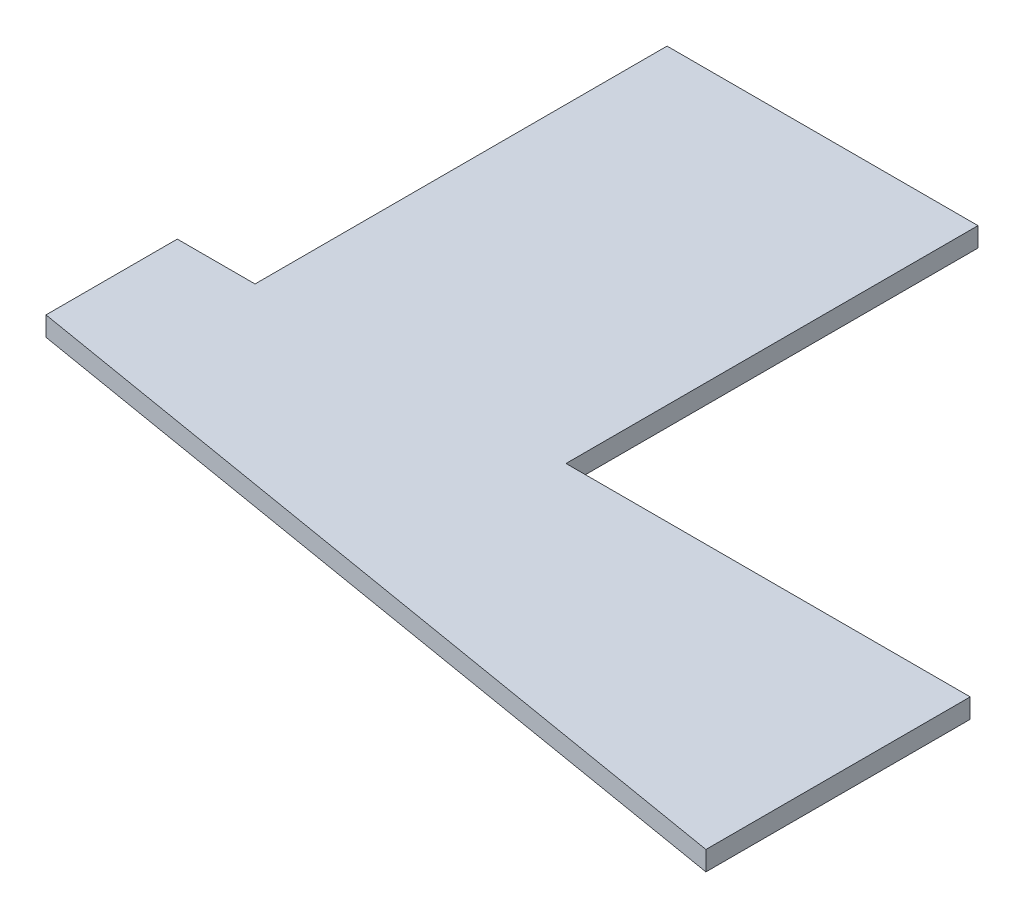
ISO-10303-21;
HEADER;
FILE_DESCRIPTION(('STEP AP214'),'2;1');
FILE_NAME('part.step','',(''),(''),'','','');
FILE_SCHEMA(('AUTOMOTIVE_DESIGN { 1 0 10303 214 1 1 1 1 }'));
ENDSEC;
DATA;
#1=APPLICATION_CONTEXT('core data for automotive mechanical design processes');
#2=APPLICATION_PROTOCOL_DEFINITION('international standard','automotive_design',2000,#1);
#3=PRODUCT_CONTEXT('',#1,'mechanical');
#4=PRODUCT('Part','Part','',(#3));
#5=PRODUCT_RELATED_PRODUCT_CATEGORY('part','',(#4));
#6=PRODUCT_DEFINITION_FORMATION('','',#4);
#7=PRODUCT_DEFINITION_CONTEXT('part definition',#1,'design');
#8=PRODUCT_DEFINITION('design','',#6,#7);
#9=PRODUCT_DEFINITION_SHAPE('','',#8);
#10=(LENGTH_UNIT() NAMED_UNIT(*) SI_UNIT(.MILLI.,.METRE.));
#11=(NAMED_UNIT(*) PLANE_ANGLE_UNIT() SI_UNIT($,.RADIAN.));
#12=(NAMED_UNIT(*) SI_UNIT($,.STERADIAN.) SOLID_ANGLE_UNIT());
#13=UNCERTAINTY_MEASURE_WITH_UNIT(LENGTH_MEASURE(1.E-05),#10,'distance_accuracy_value','');
#14=(GEOMETRIC_REPRESENTATION_CONTEXT(3) GLOBAL_UNCERTAINTY_ASSIGNED_CONTEXT((#13)) GLOBAL_UNIT_ASSIGNED_CONTEXT((#10,
#11,#12)) REPRESENTATION_CONTEXT('',''));
#15=CARTESIAN_POINT('',(0.,0.,0.));
#16=DIRECTION('',(0.,0.,1.));
#17=DIRECTION('',(1.,0.,0.));
#18=AXIS2_PLACEMENT_3D('',#15,#16,#17);
#19=CARTESIAN_POINT('',(-12.7,3.175,0.));
#20=DIRECTION('',(0.,0.,1.));
#21=DIRECTION('',(1.,0.,0.));
#22=AXIS2_PLACEMENT_3D('',#19,#20,#21);
#23=PLANE('',#22);
#24=DIRECTION('',(-1.,0.,0.));
#25=VECTOR('',#24,1.);
#26=CARTESIAN_POINT('',(-12.7,0.,0.));
#27=LINE('',#26,#25);
#28=CARTESIAN_POINT('',(0.,0.,0.));
#29=VERTEX_POINT('',#28);
#30=CARTESIAN_POINT('',(-12.7,0.,0.));
#31=VERTEX_POINT('',#30);
#32=EDGE_CURVE('E133',#29,#31,#27,.T.);
#33=ORIENTED_EDGE('',*,*,#32,.T.);
#34=DIRECTION('',(0.,-1.,0.));
#35=VECTOR('',#34,1.);
#36=CARTESIAN_POINT('',(-12.7,3.175,0.));
#37=LINE('',#36,#35);
#38=CARTESIAN_POINT('',(-12.7,3.175,0.));
#39=VERTEX_POINT('',#38);
#40=EDGE_CURVE('E11',#39,#31,#37,.T.);
#41=ORIENTED_EDGE('',*,*,#40,.F.);
#42=DIRECTION('',(-1.,0.,0.));
#43=VECTOR('',#42,1.);
#44=CARTESIAN_POINT('',(-12.7,3.175,0.));
#45=LINE('',#44,#43);
#46=CARTESIAN_POINT('',(0.,3.175,0.));
#47=VERTEX_POINT('',#46);
#48=EDGE_CURVE('E147',#47,#39,#45,.T.);
#49=ORIENTED_EDGE('',*,*,#48,.F.);
#50=DIRECTION('',(0.,-1.,0.));
#51=VECTOR('',#50,1.);
#52=CARTESIAN_POINT('',(0.,3.175,0.));
#53=LINE('',#52,#51);
#54=EDGE_CURVE('E129',#47,#29,#53,.T.);
#55=ORIENTED_EDGE('',*,*,#54,.T.);
#56=EDGE_LOOP('',(#33,#41,#49,#55));
#57=FACE_BOUND('',#56,.T.);
#58=ADVANCED_FACE('F37',(#57),#23,.F.);
#59=CARTESIAN_POINT('',(-12.7,3.175,21.449244854584));
#60=DIRECTION('',(1.,0.,0.));
#61=DIRECTION('',(0.,0.,-1.));
#62=AXIS2_PLACEMENT_3D('',#59,#60,#61);
#63=PLANE('',#62);
#64=DIRECTION('',(0.,0.,1.));
#65=VECTOR('',#64,1.);
#66=CARTESIAN_POINT('',(-12.7,0.,21.449244854584));
#67=LINE('',#66,#65);
#68=CARTESIAN_POINT('',(-12.7,0.,21.449244854584));
#69=VERTEX_POINT('',#68);
#70=EDGE_CURVE('E136',#31,#69,#67,.T.);
#71=ORIENTED_EDGE('',*,*,#70,.T.);
#72=DIRECTION('',(0.,-1.,0.));
#73=VECTOR('',#72,1.);
#74=CARTESIAN_POINT('',(-12.7,3.175,21.449244854584));
#75=LINE('',#74,#73);
#76=CARTESIAN_POINT('',(-12.7,3.175,21.449244854584));
#77=VERTEX_POINT('',#76);
#78=EDGE_CURVE('E45',#77,#69,#75,.T.);
#79=ORIENTED_EDGE('',*,*,#78,.F.);
#80=DIRECTION('',(0.,0.,1.));
#81=VECTOR('',#80,1.);
#82=CARTESIAN_POINT('',(-12.7,3.175,21.449244854584));
#83=LINE('',#82,#81);
#84=EDGE_CURVE('E96',#39,#77,#83,.T.);
#85=ORIENTED_EDGE('',*,*,#84,.F.);
#86=ORIENTED_EDGE('',*,*,#40,.T.);
#87=EDGE_LOOP('',(#71,#79,#85,#86));
#88=FACE_BOUND('',#87,.T.);
#89=ADVANCED_FACE('F182',(#88),#63,.F.);
#90=CARTESIAN_POINT('',(116.84,3.175,43.18));
#91=DIRECTION('',(0.165441536449811,0.,-0.986219599286653));
#92=DIRECTION('',(-0.986219599286653,0.,-0.165441536449811));
#93=AXIS2_PLACEMENT_3D('',#90,#91,#92);
#94=PLANE('',#93);
#95=DIRECTION('',(0.986219599286653,0.,0.165441536449811));
#96=VECTOR('',#95,1.);
#97=CARTESIAN_POINT('',(116.84,0.,43.18));
#98=LINE('',#97,#96);
#99=CARTESIAN_POINT('',(116.84,0.,43.18));
#100=VERTEX_POINT('',#99);
#101=EDGE_CURVE('E138',#69,#100,#98,.T.);
#102=ORIENTED_EDGE('',*,*,#101,.T.);
#103=DIRECTION('',(0.,-1.,0.));
#104=VECTOR('',#103,1.);
#105=CARTESIAN_POINT('',(116.84,3.175,43.18));
#106=LINE('',#105,#104);
#107=CARTESIAN_POINT('',(116.84,3.175,43.18));
#108=VERTEX_POINT('',#107);
#109=EDGE_CURVE('E154',#108,#100,#106,.T.);
#110=ORIENTED_EDGE('',*,*,#109,.F.);
#111=DIRECTION('',(0.986219599286653,0.,0.165441536449811));
#112=VECTOR('',#111,1.);
#113=CARTESIAN_POINT('',(116.84,3.175,43.18));
#114=LINE('',#113,#112);
#115=EDGE_CURVE('E162',#77,#108,#114,.T.);
#116=ORIENTED_EDGE('',*,*,#115,.F.);
#117=ORIENTED_EDGE('',*,*,#78,.T.);
#118=EDGE_LOOP('',(#102,#110,#116,#117));
#119=FACE_BOUND('',#118,.T.);
#120=ADVANCED_FACE('F160',(#119),#94,.F.);
#121=CARTESIAN_POINT('',(116.84,3.175,43.18));
#122=DIRECTION('',(-1.,0.,0.));
#123=DIRECTION('',(0.,0.,1.));
#124=AXIS2_PLACEMENT_3D('',#121,#122,#123);
#125=PLANE('',#124);
#126=DIRECTION('',(0.,0.,-1.));
#127=VECTOR('',#126,1.);
#128=CARTESIAN_POINT('',(116.84,0.,43.18));
#129=LINE('',#128,#127);
#130=CARTESIAN_POINT('',(116.84,0.,0.));
#131=VERTEX_POINT('',#130);
#132=EDGE_CURVE('E140',#100,#131,#129,.T.);
#133=ORIENTED_EDGE('',*,*,#132,.T.);
#134=DIRECTION('',(0.,-1.,0.));
#135=VECTOR('',#134,1.);
#136=CARTESIAN_POINT('',(116.84,3.175,0.));
#137=LINE('',#136,#135);
#138=CARTESIAN_POINT('',(116.84,3.175,0.));
#139=VERTEX_POINT('',#138);
#140=EDGE_CURVE('E151',#139,#131,#137,.T.);
#141=ORIENTED_EDGE('',*,*,#140,.F.);
#142=DIRECTION('',(0.,0.,-1.));
#143=VECTOR('',#142,1.);
#144=CARTESIAN_POINT('',(116.84,3.175,43.18));
#145=LINE('',#144,#143);
#146=EDGE_CURVE('E174',#108,#139,#145,.T.);
#147=ORIENTED_EDGE('',*,*,#146,.F.);
#148=ORIENTED_EDGE('',*,*,#109,.T.);
#149=EDGE_LOOP('',(#133,#141,#147,#148));
#150=FACE_BOUND('',#149,.T.);
#151=ADVANCED_FACE('F170',(#150),#125,.F.);
#152=CARTESIAN_POINT('',(50.8,3.175,0.));
#153=DIRECTION('',(0.,0.,1.));
#154=DIRECTION('',(1.,0.,0.));
#155=AXIS2_PLACEMENT_3D('',#152,#153,#154);
#156=PLANE('',#155);
#157=DIRECTION('',(-1.,0.,0.));
#158=VECTOR('',#157,1.);
#159=CARTESIAN_POINT('',(50.8,0.,0.));
#160=LINE('',#159,#158);
#161=CARTESIAN_POINT('',(50.8,0.,0.));
#162=VERTEX_POINT('',#161);
#163=EDGE_CURVE('E142',#131,#162,#160,.T.);
#164=ORIENTED_EDGE('',*,*,#163,.T.);
#165=DIRECTION('',(0.,-1.,0.));
#166=VECTOR('',#165,1.);
#167=CARTESIAN_POINT('',(50.8,3.175,0.));
#168=LINE('',#167,#166);
#169=CARTESIAN_POINT('',(50.8,3.175,0.));
#170=VERTEX_POINT('',#169);
#171=EDGE_CURVE('E124',#170,#162,#168,.T.);
#172=ORIENTED_EDGE('',*,*,#171,.F.);
#173=DIRECTION('',(-1.,0.,0.));
#174=VECTOR('',#173,1.);
#175=CARTESIAN_POINT('',(50.8,3.175,0.));
#176=LINE('',#175,#174);
#177=EDGE_CURVE('E115',#139,#170,#176,.T.);
#178=ORIENTED_EDGE('',*,*,#177,.F.);
#179=ORIENTED_EDGE('',*,*,#140,.T.);
#180=EDGE_LOOP('',(#164,#172,#178,#179));
#181=FACE_BOUND('',#180,.T.);
#182=ADVANCED_FACE('F173',(#181),#156,.F.);
#183=CARTESIAN_POINT('',(50.8,3.175,0.));
#184=DIRECTION('',(-1.,0.,0.));
#185=DIRECTION('',(0.,0.,1.));
#186=AXIS2_PLACEMENT_3D('',#183,#184,#185);
#187=PLANE('',#186);
#188=DIRECTION('',(0.,0.,-1.));
#189=VECTOR('',#188,1.);
#190=CARTESIAN_POINT('',(50.8,0.,0.));
#191=LINE('',#190,#189);
#192=CARTESIAN_POINT('',(50.8,0.,-67.31));
#193=VERTEX_POINT('',#192);
#194=EDGE_CURVE('E123',#162,#193,#191,.T.);
#195=ORIENTED_EDGE('',*,*,#194,.T.);
#196=DIRECTION('',(0.,-1.,0.));
#197=VECTOR('',#196,1.);
#198=CARTESIAN_POINT('',(50.8,3.175,-67.31));
#199=LINE('',#198,#197);
#200=CARTESIAN_POINT('',(50.8,3.175,-67.31));
#201=VERTEX_POINT('',#200);
#202=EDGE_CURVE('E120',#201,#193,#199,.T.);
#203=ORIENTED_EDGE('',*,*,#202,.F.);
#204=DIRECTION('',(0.,0.,-1.));
#205=VECTOR('',#204,1.);
#206=CARTESIAN_POINT('',(50.8,3.175,0.));
#207=LINE('',#206,#205);
#208=EDGE_CURVE('E109',#170,#201,#207,.T.);
#209=ORIENTED_EDGE('',*,*,#208,.F.);
#210=ORIENTED_EDGE('',*,*,#171,.T.);
#211=EDGE_LOOP('',(#195,#203,#209,#210));
#212=FACE_BOUND('',#211,.T.);
#213=ADVANCED_FACE('F121',(#212),#187,.F.);
#214=CARTESIAN_POINT('',(0.,3.175,-67.31));
#215=DIRECTION('',(0.,0.,1.));
#216=DIRECTION('',(1.,0.,0.));
#217=AXIS2_PLACEMENT_3D('',#214,#215,#216);
#218=PLANE('',#217);
#219=DIRECTION('',(-1.,0.,0.));
#220=VECTOR('',#219,1.);
#221=CARTESIAN_POINT('',(0.,0.,-67.31));
#222=LINE('',#221,#220);
#223=CARTESIAN_POINT('',(0.,0.,-67.31));
#224=VERTEX_POINT('',#223);
#225=EDGE_CURVE('E82',#193,#224,#222,.T.);
#226=ORIENTED_EDGE('',*,*,#225,.T.);
#227=DIRECTION('',(0.,-1.,0.));
#228=VECTOR('',#227,1.);
#229=CARTESIAN_POINT('',(0.,3.175,-67.31));
#230=LINE('',#229,#228);
#231=CARTESIAN_POINT('',(0.,3.175,-67.31));
#232=VERTEX_POINT('',#231);
#233=EDGE_CURVE('E125',#232,#224,#230,.T.);
#234=ORIENTED_EDGE('',*,*,#233,.F.);
#235=DIRECTION('',(-1.,0.,0.));
#236=VECTOR('',#235,1.);
#237=CARTESIAN_POINT('',(0.,3.175,-67.31));
#238=LINE('',#237,#236);
#239=EDGE_CURVE('E113',#201,#232,#238,.T.);
#240=ORIENTED_EDGE('',*,*,#239,.F.);
#241=ORIENTED_EDGE('',*,*,#202,.T.);
#242=EDGE_LOOP('',(#226,#234,#240,#241));
#243=FACE_BOUND('',#242,.T.);
#244=ADVANCED_FACE('F127',(#243),#218,.F.);
#245=CARTESIAN_POINT('',(0.,3.175,0.));
#246=DIRECTION('',(1.,0.,0.));
#247=DIRECTION('',(0.,0.,-1.));
#248=AXIS2_PLACEMENT_3D('',#245,#246,#247);
#249=PLANE('',#248);
#250=DIRECTION('',(0.,0.,1.));
#251=VECTOR('',#250,1.);
#252=CARTESIAN_POINT('',(0.,0.,0.));
#253=LINE('',#252,#251);
#254=EDGE_CURVE('E88',#224,#29,#253,.T.);
#255=ORIENTED_EDGE('',*,*,#254,.T.);
#256=ORIENTED_EDGE('',*,*,#54,.F.);
#257=DIRECTION('',(0.,0.,1.));
#258=VECTOR('',#257,1.);
#259=CARTESIAN_POINT('',(0.,3.175,0.));
#260=LINE('',#259,#258);
#261=EDGE_CURVE('E53',#232,#47,#260,.T.);
#262=ORIENTED_EDGE('',*,*,#261,.F.);
#263=ORIENTED_EDGE('',*,*,#233,.T.);
#264=EDGE_LOOP('',(#255,#256,#262,#263));
#265=FACE_BOUND('',#264,.T.);
#266=ADVANCED_FACE('F198',(#265),#249,.F.);
#267=CARTESIAN_POINT('',(0.,3.175,0.));
#268=DIRECTION('',(0.,1.,0.));
#269=DIRECTION('',(0.,0.,1.));
#270=AXIS2_PLACEMENT_3D('',#267,#268,#269);
#271=PLANE('',#270);
#272=ORIENTED_EDGE('',*,*,#48,.T.);
#273=ORIENTED_EDGE('',*,*,#84,.T.);
#274=ORIENTED_EDGE('',*,*,#115,.T.);
#275=ORIENTED_EDGE('',*,*,#146,.T.);
#276=ORIENTED_EDGE('',*,*,#177,.T.);
#277=ORIENTED_EDGE('',*,*,#208,.T.);
#278=ORIENTED_EDGE('',*,*,#239,.T.);
#279=ORIENTED_EDGE('',*,*,#261,.T.);
#280=EDGE_LOOP('',(#272,#273,#274,#275,#276,#277,#278,#279));
#281=FACE_BOUND('',#280,.T.);
#282=ADVANCED_FACE('F111',(#281),#271,.T.);
#283=CARTESIAN_POINT('',(0.,0.,0.));
#284=DIRECTION('',(0.,1.,0.));
#285=DIRECTION('',(0.,0.,1.));
#286=AXIS2_PLACEMENT_3D('',#283,#284,#285);
#287=PLANE('',#286);
#288=ORIENTED_EDGE('',*,*,#32,.F.);
#289=ORIENTED_EDGE('',*,*,#254,.F.);
#290=ORIENTED_EDGE('',*,*,#225,.F.);
#291=ORIENTED_EDGE('',*,*,#194,.F.);
#292=ORIENTED_EDGE('',*,*,#163,.F.);
#293=ORIENTED_EDGE('',*,*,#132,.F.);
#294=ORIENTED_EDGE('',*,*,#101,.F.);
#295=ORIENTED_EDGE('',*,*,#70,.F.);
#296=EDGE_LOOP('',(#288,#289,#290,#291,#292,#293,#294,#295));
#297=FACE_BOUND('',#296,.T.);
#298=ADVANCED_FACE('F166',(#297),#287,.F.);
#299=CLOSED_SHELL('',(#58,#89,#120,#151,#182,#213,#244,#266,#282,#298));
#300=MANIFOLD_SOLID_BREP('B2',#299);
#301=ADVANCED_BREP_SHAPE_REPRESENTATION('',(#18,#300),#14);
#302=SHAPE_DEFINITION_REPRESENTATION(#9,#301);
ENDSEC;
END-ISO-10303-21;
